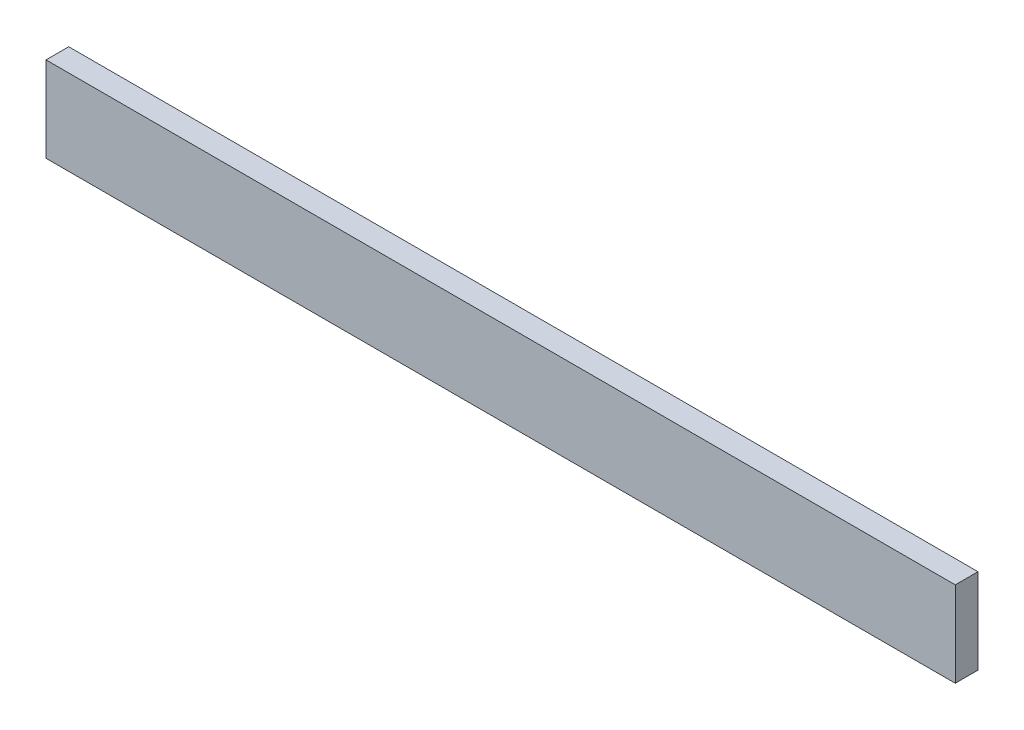
ISO-10303-21;
HEADER;
FILE_DESCRIPTION(('STEP AP214'),'2;1');
FILE_NAME('part.step','',(''),(''),'','','');
FILE_SCHEMA(('AUTOMOTIVE_DESIGN { 1 0 10303 214 1 1 1 1 }'));
ENDSEC;
DATA;
#1=APPLICATION_CONTEXT('core data for automotive mechanical design processes');
#2=APPLICATION_PROTOCOL_DEFINITION('international standard','automotive_design',2000,#1);
#3=PRODUCT_CONTEXT('',#1,'mechanical');
#4=PRODUCT('Part','Part','',(#3));
#5=PRODUCT_RELATED_PRODUCT_CATEGORY('part','',(#4));
#6=PRODUCT_DEFINITION_FORMATION('','',#4);
#7=PRODUCT_DEFINITION_CONTEXT('part definition',#1,'design');
#8=PRODUCT_DEFINITION('design','',#6,#7);
#9=PRODUCT_DEFINITION_SHAPE('','',#8);
#10=(LENGTH_UNIT() NAMED_UNIT(*) SI_UNIT(.MILLI.,.METRE.));
#11=(NAMED_UNIT(*) PLANE_ANGLE_UNIT() SI_UNIT($,.RADIAN.));
#12=(NAMED_UNIT(*) SI_UNIT($,.STERADIAN.) SOLID_ANGLE_UNIT());
#13=UNCERTAINTY_MEASURE_WITH_UNIT(LENGTH_MEASURE(1.E-05),#10,'distance_accuracy_value','');
#14=(GEOMETRIC_REPRESENTATION_CONTEXT(3) GLOBAL_UNCERTAINTY_ASSIGNED_CONTEXT((#13)) GLOBAL_UNIT_ASSIGNED_CONTEXT((#10,
#11,#12)) REPRESENTATION_CONTEXT('',''));
#15=CARTESIAN_POINT('',(0.,0.,0.));
#16=DIRECTION('',(0.,0.,1.));
#17=DIRECTION('',(1.,0.,0.));
#18=AXIS2_PLACEMENT_3D('',#15,#16,#17);
#19=CARTESIAN_POINT('',(50.8,232.6199945,2.54));
#20=DIRECTION('',(-1.,0.,0.));
#21=DIRECTION('',(0.,0.,1.));
#22=AXIS2_PLACEMENT_3D('',#19,#20,#21);
#23=PLANE('',#22);
#24=DIRECTION('',(0.,1.,0.));
#25=VECTOR('',#24,1.);
#26=CARTESIAN_POINT('',(50.8,232.6199945,0.));
#27=LINE('',#26,#25);
#28=CARTESIAN_POINT('',(50.8,232.6199945,0.));
#29=VERTEX_POINT('',#28);
#30=CARTESIAN_POINT('',(50.8,242.1449945,0.));
#31=VERTEX_POINT('',#30);
#32=EDGE_CURVE('E94',#29,#31,#27,.T.);
#33=ORIENTED_EDGE('',*,*,#32,.T.);
#34=DIRECTION('',(0.,0.,-1.));
#35=VECTOR('',#34,1.);
#36=CARTESIAN_POINT('',(50.8,242.1449945,2.54));
#37=LINE('',#36,#35);
#38=CARTESIAN_POINT('',(50.8,242.1449945,2.54));
#39=VERTEX_POINT('',#38);
#40=EDGE_CURVE('E11',#39,#31,#37,.T.);
#41=ORIENTED_EDGE('',*,*,#40,.F.);
#42=DIRECTION('',(0.,1.,0.));
#43=VECTOR('',#42,1.);
#44=CARTESIAN_POINT('',(50.8,232.6199945,2.54));
#45=LINE('',#44,#43);
#46=CARTESIAN_POINT('',(50.8,232.6199945,2.54));
#47=VERTEX_POINT('',#46);
#48=EDGE_CURVE('E82',#47,#39,#45,.T.);
#49=ORIENTED_EDGE('',*,*,#48,.F.);
#50=DIRECTION('',(0.,0.,-1.));
#51=VECTOR('',#50,1.);
#52=CARTESIAN_POINT('',(50.8,232.6199945,2.54));
#53=LINE('',#52,#51);
#54=EDGE_CURVE('E90',#47,#29,#53,.T.);
#55=ORIENTED_EDGE('',*,*,#54,.T.);
#56=EDGE_LOOP('',(#33,#41,#49,#55));
#57=FACE_BOUND('',#56,.T.);
#58=ADVANCED_FACE('F31',(#57),#23,.F.);
#59=CARTESIAN_POINT('',(50.8,242.1449945,2.54));
#60=DIRECTION('',(0.,-1.,0.));
#61=DIRECTION('',(0.,0.,-1.));
#62=AXIS2_PLACEMENT_3D('',#59,#60,#61);
#63=PLANE('',#62);
#64=DIRECTION('',(-1.,0.,0.));
#65=VECTOR('',#64,1.);
#66=CARTESIAN_POINT('',(50.8,242.1449945,0.));
#67=LINE('',#66,#65);
#68=CARTESIAN_POINT('',(-50.8,242.1449945,0.));
#69=VERTEX_POINT('',#68);
#70=EDGE_CURVE('E86',#31,#69,#67,.T.);
#71=ORIENTED_EDGE('',*,*,#70,.T.);
#72=DIRECTION('',(0.,0.,-1.));
#73=VECTOR('',#72,1.);
#74=CARTESIAN_POINT('',(-50.8,242.1449945,2.54));
#75=LINE('',#74,#73);
#76=CARTESIAN_POINT('',(-50.8,242.1449945,2.54));
#77=VERTEX_POINT('',#76);
#78=EDGE_CURVE('E39',#77,#69,#75,.T.);
#79=ORIENTED_EDGE('',*,*,#78,.F.);
#80=DIRECTION('',(-1.,0.,0.));
#81=VECTOR('',#80,1.);
#82=CARTESIAN_POINT('',(50.8,242.1449945,2.54));
#83=LINE('',#82,#81);
#84=EDGE_CURVE('E77',#39,#77,#83,.T.);
#85=ORIENTED_EDGE('',*,*,#84,.F.);
#86=ORIENTED_EDGE('',*,*,#40,.T.);
#87=EDGE_LOOP('',(#71,#79,#85,#86));
#88=FACE_BOUND('',#87,.T.);
#89=ADVANCED_FACE('F85',(#88),#63,.F.);
#90=CARTESIAN_POINT('',(-50.8,232.6199945,2.54));
#91=DIRECTION('',(1.,0.,0.));
#92=DIRECTION('',(0.,0.,-1.));
#93=AXIS2_PLACEMENT_3D('',#90,#91,#92);
#94=PLANE('',#93);
#95=DIRECTION('',(0.,-1.,0.));
#96=VECTOR('',#95,1.);
#97=CARTESIAN_POINT('',(-50.8,232.6199945,0.));
#98=LINE('',#97,#96);
#99=CARTESIAN_POINT('',(-50.8,232.6199945,0.));
#100=VERTEX_POINT('',#99);
#101=EDGE_CURVE('E64',#69,#100,#98,.T.);
#102=ORIENTED_EDGE('',*,*,#101,.T.);
#103=DIRECTION('',(0.,0.,-1.));
#104=VECTOR('',#103,1.);
#105=CARTESIAN_POINT('',(-50.8,232.6199945,2.54));
#106=LINE('',#105,#104);
#107=CARTESIAN_POINT('',(-50.8,232.6199945,2.54));
#108=VERTEX_POINT('',#107);
#109=EDGE_CURVE('E87',#108,#100,#106,.T.);
#110=ORIENTED_EDGE('',*,*,#109,.F.);
#111=DIRECTION('',(0.,-1.,0.));
#112=VECTOR('',#111,1.);
#113=CARTESIAN_POINT('',(-50.8,232.6199945,2.54));
#114=LINE('',#113,#112);
#115=EDGE_CURVE('E80',#77,#108,#114,.T.);
#116=ORIENTED_EDGE('',*,*,#115,.F.);
#117=ORIENTED_EDGE('',*,*,#78,.T.);
#118=EDGE_LOOP('',(#102,#110,#116,#117));
#119=FACE_BOUND('',#118,.T.);
#120=ADVANCED_FACE('F88',(#119),#94,.F.);
#121=CARTESIAN_POINT('',(50.8,232.6199945,2.54));
#122=DIRECTION('',(0.,1.,0.));
#123=DIRECTION('',(0.,0.,1.));
#124=AXIS2_PLACEMENT_3D('',#121,#122,#123);
#125=PLANE('',#124);
#126=DIRECTION('',(1.,0.,0.));
#127=VECTOR('',#126,1.);
#128=CARTESIAN_POINT('',(50.8,232.6199945,0.));
#129=LINE('',#128,#127);
#130=EDGE_CURVE('E70',#100,#29,#129,.T.);
#131=ORIENTED_EDGE('',*,*,#130,.T.);
#132=ORIENTED_EDGE('',*,*,#54,.F.);
#133=DIRECTION('',(1.,0.,0.));
#134=VECTOR('',#133,1.);
#135=CARTESIAN_POINT('',(50.8,232.6199945,2.54));
#136=LINE('',#135,#134);
#137=EDGE_CURVE('E47',#108,#47,#136,.T.);
#138=ORIENTED_EDGE('',*,*,#137,.F.);
#139=ORIENTED_EDGE('',*,*,#109,.T.);
#140=EDGE_LOOP('',(#131,#132,#138,#139));
#141=FACE_BOUND('',#140,.T.);
#142=ADVANCED_FACE('F101',(#141),#125,.F.);
#143=CARTESIAN_POINT('',(50.8,242.1449945,2.54));
#144=DIRECTION('',(0.,0.,1.));
#145=DIRECTION('',(1.,0.,0.));
#146=AXIS2_PLACEMENT_3D('',#143,#144,#145);
#147=PLANE('',#146);
#148=ORIENTED_EDGE('',*,*,#48,.T.);
#149=ORIENTED_EDGE('',*,*,#84,.T.);
#150=ORIENTED_EDGE('',*,*,#115,.T.);
#151=ORIENTED_EDGE('',*,*,#137,.T.);
#152=EDGE_LOOP('',(#148,#149,#150,#151));
#153=FACE_BOUND('',#152,.T.);
#154=ADVANCED_FACE('F78',(#153),#147,.T.);
#155=CARTESIAN_POINT('',(50.8,242.1449945,0.));
#156=DIRECTION('',(0.,0.,1.));
#157=DIRECTION('',(1.,0.,0.));
#158=AXIS2_PLACEMENT_3D('',#155,#156,#157);
#159=PLANE('',#158);
#160=ORIENTED_EDGE('',*,*,#32,.F.);
#161=ORIENTED_EDGE('',*,*,#130,.F.);
#162=ORIENTED_EDGE('',*,*,#101,.F.);
#163=ORIENTED_EDGE('',*,*,#70,.F.);
#164=EDGE_LOOP('',(#160,#161,#162,#163));
#165=FACE_BOUND('',#164,.T.);
#166=ADVANCED_FACE('F104',(#165),#159,.F.);
#167=CLOSED_SHELL('',(#58,#89,#120,#142,#154,#166));
#168=MANIFOLD_SOLID_BREP('B2',#167);
#169=ADVANCED_BREP_SHAPE_REPRESENTATION('',(#18,#168),#14);
#170=SHAPE_DEFINITION_REPRESENTATION(#9,#169);
ENDSEC;
END-ISO-10303-21;
